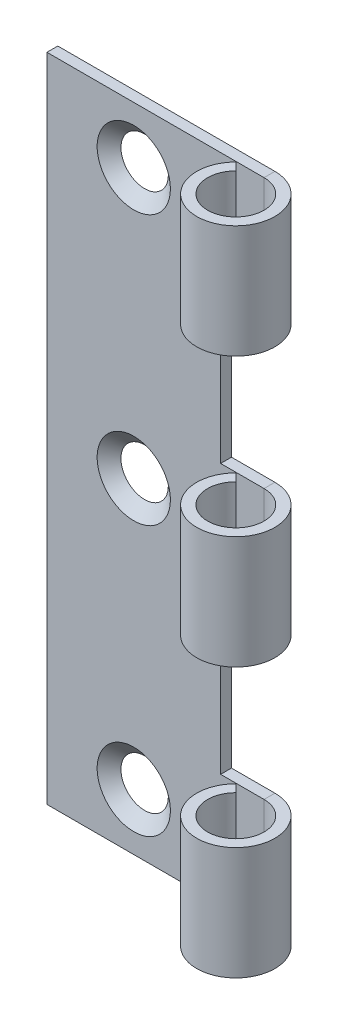
ISO-10303-21;
HEADER;
FILE_DESCRIPTION(('STEP AP214'),'2;1');
FILE_NAME('part.step','',(''),(''),'','','');
FILE_SCHEMA(('AUTOMOTIVE_DESIGN { 1 0 10303 214 1 1 1 1 }'));
ENDSEC;
DATA;
#1=APPLICATION_CONTEXT('core data for automotive mechanical design processes');
#2=APPLICATION_PROTOCOL_DEFINITION('international standard','automotive_design',2000,#1);
#3=PRODUCT_CONTEXT('',#1,'mechanical');
#4=PRODUCT('Part','Part','',(#3));
#5=PRODUCT_RELATED_PRODUCT_CATEGORY('part','',(#4));
#6=PRODUCT_DEFINITION_FORMATION('','',#4);
#7=PRODUCT_DEFINITION_CONTEXT('part definition',#1,'design');
#8=PRODUCT_DEFINITION('design','',#6,#7);
#9=PRODUCT_DEFINITION_SHAPE('','',#8);
#10=(LENGTH_UNIT() NAMED_UNIT(*) SI_UNIT(.MILLI.,.METRE.));
#11=(NAMED_UNIT(*) PLANE_ANGLE_UNIT() SI_UNIT($,.RADIAN.));
#12=(NAMED_UNIT(*) SI_UNIT($,.STERADIAN.) SOLID_ANGLE_UNIT());
#13=UNCERTAINTY_MEASURE_WITH_UNIT(LENGTH_MEASURE(1.E-05),#10,'distance_accuracy_value','');
#14=(GEOMETRIC_REPRESENTATION_CONTEXT(3) GLOBAL_UNCERTAINTY_ASSIGNED_CONTEXT((#13)) GLOBAL_UNIT_ASSIGNED_CONTEXT((#10,
#11,#12)) REPRESENTATION_CONTEXT('',''));
#15=CARTESIAN_POINT('',(0.,0.,0.));
#16=DIRECTION('',(0.,0.,1.));
#17=DIRECTION('',(1.,0.,0.));
#18=AXIS2_PLACEMENT_3D('',#15,#16,#17);
#19=CARTESIAN_POINT('',(0.,0.,-0.625));
#20=DIRECTION('',(0.,0.,-1.));
#21=DIRECTION('',(-1.,0.,0.));
#22=AXIS2_PLACEMENT_3D('',#19,#20,#21);
#23=PLANE('',#22);
#24=CARTESIAN_POINT('',(-15.,31.,-0.625));
#25=DIRECTION('',(0.,0.,-1.));
#26=DIRECTION('',(-1.,0.,0.));
#27=AXIS2_PLACEMENT_3D('',#24,#25,#26);
#28=CIRCLE('',#27,2.72670800925724);
#29=CARTESIAN_POINT('',(-17.7267080092572,31.,-0.625));
#30=VERTEX_POINT('',#29);
#31=EDGE_CURVE('E47',#30,#30,#28,.T.);
#32=ORIENTED_EDGE('',*,*,#31,.F.);
#33=EDGE_LOOP('',(#32));
#34=FACE_BOUND('',#33,.T.);
#35=CARTESIAN_POINT('',(-15.,-31.,-0.625));
#36=DIRECTION('',(0.,0.,-1.));
#37=DIRECTION('',(-1.,0.,0.));
#38=AXIS2_PLACEMENT_3D('',#35,#36,#37);
#39=CIRCLE('',#38,2.72670800925724);
#40=CARTESIAN_POINT('',(-17.7267080092572,-31.,-0.625));
#41=VERTEX_POINT('',#40);
#42=EDGE_CURVE('E219',#41,#41,#39,.T.);
#43=ORIENTED_EDGE('',*,*,#42,.F.);
#44=EDGE_LOOP('',(#43));
#45=FACE_BOUND('',#44,.T.);
#46=DIRECTION('',(0.,1.,0.));
#47=VECTOR('',#46,1.);
#48=CARTESIAN_POINT('',(0.,-37.5,-0.625));
#49=LINE('',#48,#47);
#50=CARTESIAN_POINT('',(0.,-37.5,-0.625));
#51=VERTEX_POINT('',#50);
#52=CARTESIAN_POINT('',(0.,-24.5,-0.625));
#53=VERTEX_POINT('',#52);
#54=EDGE_CURVE('E62',#51,#53,#49,.T.);
#55=ORIENTED_EDGE('',*,*,#54,.F.);
#56=DIRECTION('',(1.,0.,0.));
#57=VECTOR('',#56,1.);
#58=CARTESIAN_POINT('',(0.,-37.5,-0.625));
#59=LINE('',#58,#57);
#60=CARTESIAN_POINT('',(-25.,-37.5,-0.625));
#61=VERTEX_POINT('',#60);
#62=EDGE_CURVE('E151',#61,#51,#59,.T.);
#63=ORIENTED_EDGE('',*,*,#62,.F.);
#64=DIRECTION('',(0.,-1.,0.));
#65=VECTOR('',#64,1.);
#66=CARTESIAN_POINT('',(-25.,-37.5,-0.625));
#67=LINE('',#66,#65);
#68=CARTESIAN_POINT('',(-25.,37.5,-0.625));
#69=VERTEX_POINT('',#68);
#70=EDGE_CURVE('E139',#69,#61,#67,.T.);
#71=ORIENTED_EDGE('',*,*,#70,.F.);
#72=DIRECTION('',(-1.,0.,0.));
#73=VECTOR('',#72,1.);
#74=CARTESIAN_POINT('',(0.,37.5,-0.625));
#75=LINE('',#74,#73);
#76=CARTESIAN_POINT('',(0.,37.5,-0.625));
#77=VERTEX_POINT('',#76);
#78=EDGE_CURVE('E149',#77,#69,#75,.T.);
#79=ORIENTED_EDGE('',*,*,#78,.F.);
#80=DIRECTION('',(0.,1.,0.));
#81=VECTOR('',#80,1.);
#82=CARTESIAN_POINT('',(0.,24.5,-0.625));
#83=LINE('',#82,#81);
#84=CARTESIAN_POINT('',(0.,24.5,-0.625));
#85=VERTEX_POINT('',#84);
#86=EDGE_CURVE('E155',#85,#77,#83,.T.);
#87=ORIENTED_EDGE('',*,*,#86,.F.);
#88=DIRECTION('',(1.,0.,0.));
#89=VECTOR('',#88,1.);
#90=CARTESIAN_POINT('',(0.,24.5,-0.625));
#91=LINE('',#90,#89);
#92=CARTESIAN_POINT('',(-4.99999999999997,24.5,-0.625));
#93=VERTEX_POINT('',#92);
#94=EDGE_CURVE('E157',#93,#85,#91,.T.);
#95=ORIENTED_EDGE('',*,*,#94,.F.);
#96=DIRECTION('',(0.,1.,0.));
#97=VECTOR('',#96,1.);
#98=CARTESIAN_POINT('',(-4.99999999999997,24.5,-0.625));
#99=LINE('',#98,#97);
#100=CARTESIAN_POINT('',(-5.,6.5,-0.625));
#101=VERTEX_POINT('',#100);
#102=EDGE_CURVE('E317',#101,#93,#99,.T.);
#103=ORIENTED_EDGE('',*,*,#102,.F.);
#104=DIRECTION('',(-1.,0.,0.));
#105=VECTOR('',#104,1.);
#106=CARTESIAN_POINT('',(-5.,6.5,-0.625));
#107=LINE('',#106,#105);
#108=CARTESIAN_POINT('',(0.,6.5,-0.625));
#109=VERTEX_POINT('',#108);
#110=EDGE_CURVE('E314',#109,#101,#107,.T.);
#111=ORIENTED_EDGE('',*,*,#110,.F.);
#112=DIRECTION('',(0.,1.,0.));
#113=VECTOR('',#112,1.);
#114=CARTESIAN_POINT('',(0.,-6.5,-0.625));
#115=LINE('',#114,#113);
#116=CARTESIAN_POINT('',(0.,-6.5,-0.625));
#117=VERTEX_POINT('',#116);
#118=EDGE_CURVE('E311',#117,#109,#115,.T.);
#119=ORIENTED_EDGE('',*,*,#118,.F.);
#120=DIRECTION('',(1.,0.,0.));
#121=VECTOR('',#120,1.);
#122=CARTESIAN_POINT('',(0.,-6.5,-0.625));
#123=LINE('',#122,#121);
#124=CARTESIAN_POINT('',(-4.99999999999997,-6.5,-0.625));
#125=VERTEX_POINT('',#124);
#126=EDGE_CURVE('E308',#125,#117,#123,.T.);
#127=ORIENTED_EDGE('',*,*,#126,.F.);
#128=DIRECTION('',(0.,1.,0.));
#129=VECTOR('',#128,1.);
#130=CARTESIAN_POINT('',(-4.99999999999997,-6.5,-0.625));
#131=LINE('',#130,#129);
#132=CARTESIAN_POINT('',(-5.,-24.5,-0.625));
#133=VERTEX_POINT('',#132);
#134=EDGE_CURVE('E305',#133,#125,#131,.T.);
#135=ORIENTED_EDGE('',*,*,#134,.F.);
#136=DIRECTION('',(-1.,0.,0.));
#137=VECTOR('',#136,1.);
#138=CARTESIAN_POINT('',(-5.,-24.5,-0.625));
#139=LINE('',#138,#137);
#140=EDGE_CURVE('E303',#53,#133,#139,.T.);
#141=ORIENTED_EDGE('',*,*,#140,.F.);
#142=EDGE_LOOP('',(#55,#63,#71,#79,#87,#95,#103,#111,#119,#127,#135,#141));
#143=FACE_BOUND('',#142,.T.);
#144=CARTESIAN_POINT('',(-15.,0.,-0.625));
#145=DIRECTION('',(0.,0.,-1.));
#146=DIRECTION('',(-1.,0.,0.));
#147=AXIS2_PLACEMENT_3D('',#144,#145,#146);
#148=CIRCLE('',#147,2.72670800925724);
#149=CARTESIAN_POINT('',(-17.7267080092572,0.,-0.625));
#150=VERTEX_POINT('',#149);
#151=EDGE_CURVE('E212',#150,#150,#148,.T.);
#152=ORIENTED_EDGE('',*,*,#151,.F.);
#153=EDGE_LOOP('',(#152));
#154=FACE_BOUND('',#153,.T.);
#155=ADVANCED_FACE('F43',(#34,#45,#143,#154),#23,.T.);
#156=CARTESIAN_POINT('',(0.,-37.5,-0.625));
#157=DIRECTION('',(0.,-1.,0.));
#158=DIRECTION('',(0.,0.,-1.));
#159=AXIS2_PLACEMENT_3D('',#156,#157,#158);
#160=PLANE('',#159);
#161=DIRECTION('',(1.,0.,0.));
#162=VECTOR('',#161,1.);
#163=CARTESIAN_POINT('',(0.,-37.5,0.625));
#164=LINE('',#163,#162);
#165=CARTESIAN_POINT('',(-25.,-37.5,0.625));
#166=VERTEX_POINT('',#165);
#167=CARTESIAN_POINT('',(0.,-37.5,0.625));
#168=VERTEX_POINT('',#167);
#169=EDGE_CURVE('E193',#166,#168,#164,.T.);
#170=ORIENTED_EDGE('',*,*,#169,.F.);
#171=DIRECTION('',(0.,0.,1.));
#172=VECTOR('',#171,1.);
#173=CARTESIAN_POINT('',(-25.,-37.5,-0.625));
#174=LINE('',#173,#172);
#175=EDGE_CURVE('E53',#61,#166,#174,.T.);
#176=ORIENTED_EDGE('',*,*,#175,.F.);
#177=ORIENTED_EDGE('',*,*,#62,.T.);
#178=DIRECTION('',(0.,0.,1.));
#179=VECTOR('',#178,1.);
#180=CARTESIAN_POINT('',(0.,-37.5,-0.625));
#181=LINE('',#180,#179);
#182=EDGE_CURVE('E11',#51,#168,#181,.T.);
#183=ORIENTED_EDGE('',*,*,#182,.T.);
#184=EDGE_LOOP('',(#170,#176,#177,#183));
#185=FACE_BOUND('',#184,.T.);
#186=ADVANCED_FACE('F399',(#185),#160,.T.);
#187=CARTESIAN_POINT('',(-25.,-37.5,-0.625));
#188=DIRECTION('',(-1.,0.,0.));
#189=DIRECTION('',(0.,0.,1.));
#190=AXIS2_PLACEMENT_3D('',#187,#188,#189);
#191=PLANE('',#190);
#192=DIRECTION('',(0.,-1.,0.));
#193=VECTOR('',#192,1.);
#194=CARTESIAN_POINT('',(-25.,-37.5,0.625));
#195=LINE('',#194,#193);
#196=CARTESIAN_POINT('',(-25.,37.5,0.625));
#197=VERTEX_POINT('',#196);
#198=EDGE_CURVE('E140',#197,#166,#195,.T.);
#199=ORIENTED_EDGE('',*,*,#198,.F.);
#200=DIRECTION('',(0.,0.,1.));
#201=VECTOR('',#200,1.);
#202=CARTESIAN_POINT('',(-25.,37.5,-0.625));
#203=LINE('',#202,#201);
#204=EDGE_CURVE('E136',#69,#197,#203,.T.);
#205=ORIENTED_EDGE('',*,*,#204,.F.);
#206=ORIENTED_EDGE('',*,*,#70,.T.);
#207=ORIENTED_EDGE('',*,*,#175,.T.);
#208=EDGE_LOOP('',(#199,#205,#206,#207));
#209=FACE_BOUND('',#208,.T.);
#210=ADVANCED_FACE('F138',(#209),#191,.T.);
#211=CARTESIAN_POINT('',(0.,37.5,-0.625));
#212=DIRECTION('',(0.,1.,0.));
#213=DIRECTION('',(-1.,0.,0.));
#214=AXIS2_PLACEMENT_3D('',#211,#212,#213);
#215=PLANE('',#214);
#216=DIRECTION('',(-1.,0.,0.));
#217=VECTOR('',#216,1.);
#218=CARTESIAN_POINT('',(0.,37.5,0.625));
#219=LINE('',#218,#217);
#220=CARTESIAN_POINT('',(0.,37.5,0.625000000000001));
#221=VERTEX_POINT('',#220);
#222=EDGE_CURVE('E190',#221,#197,#219,.T.);
#223=ORIENTED_EDGE('',*,*,#222,.F.);
#224=DIRECTION('',(0.,0.,1.));
#225=VECTOR('',#224,1.);
#226=CARTESIAN_POINT('',(0.,37.5,-0.625));
#227=LINE('',#226,#225);
#228=EDGE_CURVE('E145',#77,#221,#227,.T.);
#229=ORIENTED_EDGE('',*,*,#228,.F.);
#230=ORIENTED_EDGE('',*,*,#78,.T.);
#231=ORIENTED_EDGE('',*,*,#204,.T.);
#232=EDGE_LOOP('',(#223,#229,#230,#231));
#233=FACE_BOUND('',#232,.T.);
#234=ADVANCED_FACE('F153',(#233),#215,.T.);
#235=CARTESIAN_POINT('',(0.,24.5,-0.625));
#236=DIRECTION('',(0.,-1.,0.));
#237=DIRECTION('',(0.,0.,-1.));
#238=AXIS2_PLACEMENT_3D('',#235,#236,#237);
#239=PLANE('',#238);
#240=DIRECTION('',(1.,0.,0.));
#241=VECTOR('',#240,1.);
#242=CARTESIAN_POINT('',(0.,24.5,0.625));
#243=LINE('',#242,#241);
#244=CARTESIAN_POINT('',(-4.99999999999997,24.5,0.625));
#245=VERTEX_POINT('',#244);
#246=CARTESIAN_POINT('',(0.,24.5,0.625));
#247=VERTEX_POINT('',#246);
#248=EDGE_CURVE('E184',#245,#247,#243,.T.);
#249=ORIENTED_EDGE('',*,*,#248,.F.);
#250=DIRECTION('',(0.,0.,1.));
#251=VECTOR('',#250,1.);
#252=CARTESIAN_POINT('',(-4.99999999999997,24.5,-0.625));
#253=LINE('',#252,#251);
#254=EDGE_CURVE('E199',#93,#245,#253,.T.);
#255=ORIENTED_EDGE('',*,*,#254,.F.);
#256=ORIENTED_EDGE('',*,*,#94,.T.);
#257=DIRECTION('',(0.,0.,1.));
#258=VECTOR('',#257,1.);
#259=CARTESIAN_POINT('',(0.,24.5,-0.625));
#260=LINE('',#259,#258);
#261=EDGE_CURVE('E197',#85,#247,#260,.T.);
#262=ORIENTED_EDGE('',*,*,#261,.T.);
#263=EDGE_LOOP('',(#249,#255,#256,#262));
#264=FACE_BOUND('',#263,.T.);
#265=ADVANCED_FACE('F324',(#264),#239,.T.);
#266=CARTESIAN_POINT('',(-4.99999999999997,24.5,-0.625));
#267=DIRECTION('',(1.,0.,0.));
#268=DIRECTION('',(0.,1.,0.));
#269=AXIS2_PLACEMENT_3D('',#266,#267,#268);
#270=PLANE('',#269);
#271=DIRECTION('',(0.,1.,0.));
#272=VECTOR('',#271,1.);
#273=CARTESIAN_POINT('',(-4.99999999999997,24.5,0.625));
#274=LINE('',#273,#272);
#275=CARTESIAN_POINT('',(-5.,6.5,0.625));
#276=VERTEX_POINT('',#275);
#277=EDGE_CURVE('E181',#276,#245,#274,.T.);
#278=ORIENTED_EDGE('',*,*,#277,.F.);
#279=DIRECTION('',(0.,0.,1.));
#280=VECTOR('',#279,1.);
#281=CARTESIAN_POINT('',(-5.,6.5,-0.625));
#282=LINE('',#281,#280);
#283=EDGE_CURVE('E201',#101,#276,#282,.T.);
#284=ORIENTED_EDGE('',*,*,#283,.F.);
#285=ORIENTED_EDGE('',*,*,#102,.T.);
#286=ORIENTED_EDGE('',*,*,#254,.T.);
#287=EDGE_LOOP('',(#278,#284,#285,#286));
#288=FACE_BOUND('',#287,.T.);
#289=ADVANCED_FACE('F419',(#288),#270,.T.);
#290=CARTESIAN_POINT('',(-5.,6.5,-0.625));
#291=DIRECTION('',(0.,1.,0.));
#292=DIRECTION('',(-1.,0.,0.));
#293=AXIS2_PLACEMENT_3D('',#290,#291,#292);
#294=PLANE('',#293);
#295=DIRECTION('',(-1.,0.,0.));
#296=VECTOR('',#295,1.);
#297=CARTESIAN_POINT('',(-5.,6.5,0.625));
#298=LINE('',#297,#296);
#299=CARTESIAN_POINT('',(0.,6.5,0.625));
#300=VERTEX_POINT('',#299);
#301=EDGE_CURVE('E178',#300,#276,#298,.T.);
#302=ORIENTED_EDGE('',*,*,#301,.F.);
#303=DIRECTION('',(0.,0.,1.));
#304=VECTOR('',#303,1.);
#305=CARTESIAN_POINT('',(0.,6.5,-0.625));
#306=LINE('',#305,#304);
#307=EDGE_CURVE('E203',#109,#300,#306,.T.);
#308=ORIENTED_EDGE('',*,*,#307,.F.);
#309=ORIENTED_EDGE('',*,*,#110,.T.);
#310=ORIENTED_EDGE('',*,*,#283,.T.);
#311=EDGE_LOOP('',(#302,#308,#309,#310));
#312=FACE_BOUND('',#311,.T.);
#313=ADVANCED_FACE('F422',(#312),#294,.T.);
#314=CARTESIAN_POINT('',(0.,-6.5,-0.625));
#315=DIRECTION('',(0.,-1.,0.));
#316=DIRECTION('',(1.,0.,0.));
#317=AXIS2_PLACEMENT_3D('',#314,#315,#316);
#318=PLANE('',#317);
#319=DIRECTION('',(1.,0.,0.));
#320=VECTOR('',#319,1.);
#321=CARTESIAN_POINT('',(0.,-6.5,0.625));
#322=LINE('',#321,#320);
#323=CARTESIAN_POINT('',(-4.99999999999997,-6.5,0.625));
#324=VERTEX_POINT('',#323);
#325=CARTESIAN_POINT('',(0.,-6.5,0.625));
#326=VERTEX_POINT('',#325);
#327=EDGE_CURVE('E172',#324,#326,#322,.T.);
#328=ORIENTED_EDGE('',*,*,#327,.F.);
#329=DIRECTION('',(0.,0.,1.));
#330=VECTOR('',#329,1.);
#331=CARTESIAN_POINT('',(-4.99999999999997,-6.5,-0.625));
#332=LINE('',#331,#330);
#333=EDGE_CURVE('E208',#125,#324,#332,.T.);
#334=ORIENTED_EDGE('',*,*,#333,.F.);
#335=ORIENTED_EDGE('',*,*,#126,.T.);
#336=DIRECTION('',(0.,0.,1.));
#337=VECTOR('',#336,1.);
#338=CARTESIAN_POINT('',(0.,-6.5,-0.625));
#339=LINE('',#338,#337);
#340=EDGE_CURVE('E206',#117,#326,#339,.T.);
#341=ORIENTED_EDGE('',*,*,#340,.T.);
#342=EDGE_LOOP('',(#328,#334,#335,#341));
#343=FACE_BOUND('',#342,.T.);
#344=ADVANCED_FACE('F426',(#343),#318,.T.);
#345=CARTESIAN_POINT('',(-4.99999999999997,-6.5,-0.625));
#346=DIRECTION('',(1.,0.,0.));
#347=DIRECTION('',(0.,1.,0.));
#348=AXIS2_PLACEMENT_3D('',#345,#346,#347);
#349=PLANE('',#348);
#350=DIRECTION('',(0.,1.,0.));
#351=VECTOR('',#350,1.);
#352=CARTESIAN_POINT('',(-4.99999999999997,-6.5,0.625));
#353=LINE('',#352,#351);
#354=CARTESIAN_POINT('',(-5.,-24.5,0.625));
#355=VERTEX_POINT('',#354);
#356=EDGE_CURVE('E169',#355,#324,#353,.T.);
#357=ORIENTED_EDGE('',*,*,#356,.F.);
#358=DIRECTION('',(0.,0.,1.));
#359=VECTOR('',#358,1.);
#360=CARTESIAN_POINT('',(-5.,-24.5,-0.625));
#361=LINE('',#360,#359);
#362=EDGE_CURVE('E210',#133,#355,#361,.T.);
#363=ORIENTED_EDGE('',*,*,#362,.F.);
#364=ORIENTED_EDGE('',*,*,#134,.T.);
#365=ORIENTED_EDGE('',*,*,#333,.T.);
#366=EDGE_LOOP('',(#357,#363,#364,#365));
#367=FACE_BOUND('',#366,.T.);
#368=ADVANCED_FACE('F429',(#367),#349,.T.);
#369=CARTESIAN_POINT('',(-5.,-24.5,-0.625));
#370=DIRECTION('',(0.,1.,0.));
#371=DIRECTION('',(-1.,0.,0.));
#372=AXIS2_PLACEMENT_3D('',#369,#370,#371);
#373=PLANE('',#372);
#374=DIRECTION('',(-1.,0.,0.));
#375=VECTOR('',#374,1.);
#376=CARTESIAN_POINT('',(-5.,-24.5,0.625));
#377=LINE('',#376,#375);
#378=CARTESIAN_POINT('',(0.,-24.5,0.625));
#379=VERTEX_POINT('',#378);
#380=EDGE_CURVE('E165',#379,#355,#377,.T.);
#381=ORIENTED_EDGE('',*,*,#380,.F.);
#382=DIRECTION('',(0.,0.,1.));
#383=VECTOR('',#382,1.);
#384=CARTESIAN_POINT('',(0.,-24.5,-0.625));
#385=LINE('',#384,#383);
#386=EDGE_CURVE('E108',#53,#379,#385,.T.);
#387=ORIENTED_EDGE('',*,*,#386,.F.);
#388=ORIENTED_EDGE('',*,*,#140,.T.);
#389=ORIENTED_EDGE('',*,*,#362,.T.);
#390=EDGE_LOOP('',(#381,#387,#388,#389));
#391=FACE_BOUND('',#390,.T.);
#392=ADVANCED_FACE('F45',(#391),#373,.T.);
#393=CARTESIAN_POINT('',(0.,0.,0.625));
#394=DIRECTION('',(0.,0.,-1.));
#395=DIRECTION('',(-1.,0.,0.));
#396=AXIS2_PLACEMENT_3D('',#393,#394,#395);
#397=PLANE('',#396);
#398=CARTESIAN_POINT('',(-15.,31.,0.625));
#399=DIRECTION('',(0.,0.,1.));
#400=DIRECTION('',(1.,0.,0.));
#401=AXIS2_PLACEMENT_3D('',#398,#399,#400);
#402=CIRCLE('',#401,4.2164);
#403=CARTESIAN_POINT('',(-10.7836,31.,0.625));
#404=VERTEX_POINT('',#403);
#405=EDGE_CURVE('E226',#404,#404,#402,.T.);
#406=ORIENTED_EDGE('',*,*,#405,.F.);
#407=EDGE_LOOP('',(#406));
#408=FACE_BOUND('',#407,.T.);
#409=CARTESIAN_POINT('',(-15.,0.,0.625));
#410=DIRECTION('',(0.,0.,1.));
#411=DIRECTION('',(1.,0.,0.));
#412=AXIS2_PLACEMENT_3D('',#409,#410,#411);
#413=CIRCLE('',#412,4.2164);
#414=CARTESIAN_POINT('',(-10.7836,0.,0.625));
#415=VERTEX_POINT('',#414);
#416=EDGE_CURVE('E215',#415,#415,#413,.T.);
#417=ORIENTED_EDGE('',*,*,#416,.F.);
#418=EDGE_LOOP('',(#417));
#419=FACE_BOUND('',#418,.T.);
#420=CARTESIAN_POINT('',(-15.,-31.,0.625));
#421=DIRECTION('',(0.,0.,1.));
#422=DIRECTION('',(1.,0.,0.));
#423=AXIS2_PLACEMENT_3D('',#420,#421,#422);
#424=CIRCLE('',#423,4.2164);
#425=CARTESIAN_POINT('',(-10.7836,-31.,0.625));
#426=VERTEX_POINT('',#425);
#427=EDGE_CURVE('E214',#426,#426,#424,.T.);
#428=ORIENTED_EDGE('',*,*,#427,.F.);
#429=EDGE_LOOP('',(#428));
#430=FACE_BOUND('',#429,.T.);
#431=DIRECTION('',(0.,1.,0.));
#432=VECTOR('',#431,1.);
#433=CARTESIAN_POINT('',(0.,-37.5,0.625));
#434=LINE('',#433,#432);
#435=EDGE_CURVE('E162',#168,#379,#434,.T.);
#436=ORIENTED_EDGE('',*,*,#435,.T.);
#437=ORIENTED_EDGE('',*,*,#380,.T.);
#438=ORIENTED_EDGE('',*,*,#356,.T.);
#439=ORIENTED_EDGE('',*,*,#327,.T.);
#440=DIRECTION('',(0.,1.,0.));
#441=VECTOR('',#440,1.);
#442=CARTESIAN_POINT('',(0.,-6.5,0.625));
#443=LINE('',#442,#441);
#444=EDGE_CURVE('E175',#326,#300,#443,.T.);
#445=ORIENTED_EDGE('',*,*,#444,.T.);
#446=ORIENTED_EDGE('',*,*,#301,.T.);
#447=ORIENTED_EDGE('',*,*,#277,.T.);
#448=ORIENTED_EDGE('',*,*,#248,.T.);
#449=DIRECTION('',(0.,1.,0.));
#450=VECTOR('',#449,1.);
#451=CARTESIAN_POINT('',(0.,24.5,0.625));
#452=LINE('',#451,#450);
#453=EDGE_CURVE('E187',#247,#221,#452,.T.);
#454=ORIENTED_EDGE('',*,*,#453,.T.);
#455=ORIENTED_EDGE('',*,*,#222,.T.);
#456=ORIENTED_EDGE('',*,*,#198,.T.);
#457=ORIENTED_EDGE('',*,*,#169,.T.);
#458=EDGE_LOOP('',(#436,#437,#438,#439,#445,#446,#447,#448,#454,#455,#456,#457));
#459=FACE_BOUND('',#458,.T.);
#460=ADVANCED_FACE('F395',(#408,#419,#430,#459),#397,.F.);
#461=CARTESIAN_POINT('',(-2.29809703885625,-31.,1.57690296114369));
#462=DIRECTION('',(-0.707106781186556,0.,0.707106781186539));
#463=DIRECTION('',(0.,1.,0.));
#464=AXIS2_PLACEMENT_3D('',#461,#462,#463);
#465=PLANE('',#464);
#466=DIRECTION('',(-0.707106781186539,0.,-0.707106781186556));
#467=VECTOR('',#466,1.);
#468=CARTESIAN_POINT('',(-2.29809703885625,-24.5,1.57690296114369));
#469=LINE('',#468,#467);
#470=CARTESIAN_POINT('',(-2.29809703885625,-24.5,1.57690296114369));
#471=VERTEX_POINT('',#470);
#472=CARTESIAN_POINT('',(-3.18198051533943,-24.5,0.693019484660497));
#473=VERTEX_POINT('',#472);
#474=EDGE_CURVE('E166',#471,#473,#469,.T.);
#475=ORIENTED_EDGE('',*,*,#474,.F.);
#476=DIRECTION('',(0.,1.,0.));
#477=VECTOR('',#476,1.);
#478=CARTESIAN_POINT('',(-2.29809703885625,-24.5,1.57690296114369));
#479=LINE('',#478,#477);
#480=CARTESIAN_POINT('',(-2.29809703885625,-37.5,1.57690296114369));
#481=VERTEX_POINT('',#480);
#482=EDGE_CURVE('E279',#481,#471,#479,.T.);
#483=ORIENTED_EDGE('',*,*,#482,.F.);
#484=DIRECTION('',(-0.707106781186539,0.,-0.707106781186556));
#485=VECTOR('',#484,1.);
#486=CARTESIAN_POINT('',(-2.29809703885625,-37.5,1.57690296114369));
#487=LINE('',#486,#485);
#488=CARTESIAN_POINT('',(-3.18198051533943,-37.5,0.693019484660497));
#489=VERTEX_POINT('',#488);
#490=EDGE_CURVE('E283',#481,#489,#487,.T.);
#491=ORIENTED_EDGE('',*,*,#490,.T.);
#492=DIRECTION('',(0.,1.,0.));
#493=VECTOR('',#492,1.);
#494=CARTESIAN_POINT('',(-3.18198051533943,-24.5,0.693019484660497));
#495=LINE('',#494,#493);
#496=EDGE_CURVE('E285',#489,#473,#495,.T.);
#497=ORIENTED_EDGE('',*,*,#496,.T.);
#498=EDGE_LOOP('',(#475,#483,#491,#497));
#499=FACE_BOUND('',#498,.T.);
#500=ADVANCED_FACE('F375',(#499),#465,.F.);
#501=CARTESIAN_POINT('',(0.,-37.5,3.875));
#502=DIRECTION('',(0.,-1.,0.));
#503=DIRECTION('',(0.,0.,-1.));
#504=AXIS2_PLACEMENT_3D('',#501,#502,#503);
#505=PLANE('',#504);
#506=ORIENTED_EDGE('',*,*,#490,.F.);
#507=CARTESIAN_POINT('',(0.,-37.5,3.875));
#508=DIRECTION('',(0.,1.,0.));
#509=DIRECTION('',(0.,0.,1.));
#510=AXIS2_PLACEMENT_3D('',#507,#508,#509);
#511=CIRCLE('',#510,3.25);
#512=EDGE_CURVE('E288',#168,#481,#511,.F.);
#513=ORIENTED_EDGE('',*,*,#512,.F.);
#514=ORIENTED_EDGE('',*,*,#182,.F.);
#515=CARTESIAN_POINT('',(0.,-37.5,3.875));
#516=DIRECTION('',(0.,1.,0.));
#517=DIRECTION('',(0.,0.,1.));
#518=AXIS2_PLACEMENT_3D('',#515,#516,#517);
#519=CIRCLE('',#518,4.5);
#520=EDGE_CURVE('E280',#51,#489,#519,.F.);
#521=ORIENTED_EDGE('',*,*,#520,.T.);
#522=EDGE_LOOP('',(#506,#513,#514,#521));
#523=FACE_BOUND('',#522,.T.);
#524=ADVANCED_FACE('F387',(#523),#505,.T.);
#525=CARTESIAN_POINT('',(0.,-24.5,3.875));
#526=DIRECTION('',(0.,-1.,0.));
#527=DIRECTION('',(0.,0.,-1.));
#528=AXIS2_PLACEMENT_3D('',#525,#526,#527);
#529=PLANE('',#528);
#530=CARTESIAN_POINT('',(0.,-24.5,3.875));
#531=DIRECTION('',(0.,1.,0.));
#532=DIRECTION('',(0.,0.,1.));
#533=AXIS2_PLACEMENT_3D('',#530,#531,#532);
#534=CIRCLE('',#533,3.25);
#535=EDGE_CURVE('E293',#471,#379,#534,.T.);
#536=ORIENTED_EDGE('',*,*,#535,.F.);
#537=ORIENTED_EDGE('',*,*,#474,.T.);
#538=CARTESIAN_POINT('',(0.,-24.5,3.875));
#539=DIRECTION('',(0.,1.,0.));
#540=DIRECTION('',(0.,0.,1.));
#541=AXIS2_PLACEMENT_3D('',#538,#539,#540);
#542=CIRCLE('',#541,4.5);
#543=EDGE_CURVE('E284',#473,#53,#542,.T.);
#544=ORIENTED_EDGE('',*,*,#543,.T.);
#545=ORIENTED_EDGE('',*,*,#386,.T.);
#546=EDGE_LOOP('',(#536,#537,#544,#545));
#547=FACE_BOUND('',#546,.T.);
#548=ADVANCED_FACE('F383',(#547),#529,.F.);
#549=CARTESIAN_POINT('',(0.,-24.5,3.875));
#550=DIRECTION('',(0.,1.,0.));
#551=DIRECTION('',(-0.707106781186539,0.,-0.707106781186556));
#552=AXIS2_PLACEMENT_3D('',#549,#550,#551);
#553=CYLINDRICAL_SURFACE('',#552,4.5);
#554=ORIENTED_EDGE('',*,*,#54,.T.);
#555=ORIENTED_EDGE('',*,*,#543,.F.);
#556=ORIENTED_EDGE('',*,*,#496,.F.);
#557=ORIENTED_EDGE('',*,*,#520,.F.);
#558=EDGE_LOOP('',(#554,#555,#556,#557));
#559=FACE_BOUND('',#558,.T.);
#560=ADVANCED_FACE('F385',(#559),#553,.T.);
#561=CARTESIAN_POINT('',(0.,-24.5,3.875));
#562=DIRECTION('',(0.,1.,0.));
#563=DIRECTION('',(-0.707106781186539,0.,-0.707106781186556));
#564=AXIS2_PLACEMENT_3D('',#561,#562,#563);
#565=CYLINDRICAL_SURFACE('',#564,3.25);
#566=ORIENTED_EDGE('',*,*,#435,.F.);
#567=ORIENTED_EDGE('',*,*,#512,.T.);
#568=ORIENTED_EDGE('',*,*,#482,.T.);
#569=ORIENTED_EDGE('',*,*,#535,.T.);
#570=EDGE_LOOP('',(#566,#567,#568,#569));
#571=FACE_BOUND('',#570,.T.);
#572=ADVANCED_FACE('F382',(#571),#565,.F.);
#573=CARTESIAN_POINT('',(-2.29809703885625,0.,1.57690296114369));
#574=DIRECTION('',(-0.707106781186556,0.,0.707106781186539));
#575=DIRECTION('',(0.,1.,0.));
#576=AXIS2_PLACEMENT_3D('',#573,#574,#575);
#577=PLANE('',#576);
#578=DIRECTION('',(-0.707106781186539,0.,-0.707106781186556));
#579=VECTOR('',#578,1.);
#580=CARTESIAN_POINT('',(-2.29809703885625,6.5,1.57690296114369));
#581=LINE('',#580,#579);
#582=CARTESIAN_POINT('',(-2.29809703885625,6.5,1.57690296114369));
#583=VERTEX_POINT('',#582);
#584=CARTESIAN_POINT('',(-3.18198051533942,6.5,0.693019484660497));
#585=VERTEX_POINT('',#584);
#586=EDGE_CURVE('E276',#583,#585,#581,.T.);
#587=ORIENTED_EDGE('',*,*,#586,.F.);
#588=DIRECTION('',(0.,1.,0.));
#589=VECTOR('',#588,1.);
#590=CARTESIAN_POINT('',(-2.29809703885625,6.5,1.57690296114369));
#591=LINE('',#590,#589);
#592=CARTESIAN_POINT('',(-2.29809703885625,-6.5,1.57690296114369));
#593=VERTEX_POINT('',#592);
#594=EDGE_CURVE('E255',#593,#583,#591,.T.);
#595=ORIENTED_EDGE('',*,*,#594,.F.);
#596=DIRECTION('',(-0.707106781186539,0.,-0.707106781186556));
#597=VECTOR('',#596,1.);
#598=CARTESIAN_POINT('',(-2.29809703885625,-6.5,1.57690296114369));
#599=LINE('',#598,#597);
#600=CARTESIAN_POINT('',(-3.18198051533942,-6.5,0.693019484660497));
#601=VERTEX_POINT('',#600);
#602=EDGE_CURVE('E259',#593,#601,#599,.T.);
#603=ORIENTED_EDGE('',*,*,#602,.T.);
#604=DIRECTION('',(0.,1.,0.));
#605=VECTOR('',#604,1.);
#606=CARTESIAN_POINT('',(-3.18198051533942,6.5,0.693019484660497));
#607=LINE('',#606,#605);
#608=EDGE_CURVE('E261',#601,#585,#607,.T.);
#609=ORIENTED_EDGE('',*,*,#608,.T.);
#610=EDGE_LOOP('',(#587,#595,#603,#609));
#611=FACE_BOUND('',#610,.T.);
#612=ADVANCED_FACE('F452',(#611),#577,.F.);
#613=CARTESIAN_POINT('',(0.,-6.5,3.875));
#614=DIRECTION('',(0.,-1.,0.));
#615=DIRECTION('',(1.,0.,0.));
#616=AXIS2_PLACEMENT_3D('',#613,#614,#615);
#617=PLANE('',#616);
#618=ORIENTED_EDGE('',*,*,#602,.F.);
#619=CARTESIAN_POINT('',(0.,-6.5,3.875));
#620=DIRECTION('',(0.,1.,0.));
#621=DIRECTION('',(-1.,0.,0.));
#622=AXIS2_PLACEMENT_3D('',#619,#620,#621);
#623=CIRCLE('',#622,3.25);
#624=EDGE_CURVE('E264',#326,#593,#623,.F.);
#625=ORIENTED_EDGE('',*,*,#624,.F.);
#626=ORIENTED_EDGE('',*,*,#340,.F.);
#627=CARTESIAN_POINT('',(0.,-6.5,3.875));
#628=DIRECTION('',(0.,1.,0.));
#629=DIRECTION('',(-1.,0.,0.));
#630=AXIS2_PLACEMENT_3D('',#627,#628,#629);
#631=CIRCLE('',#630,4.5);
#632=EDGE_CURVE('E256',#117,#601,#631,.F.);
#633=ORIENTED_EDGE('',*,*,#632,.T.);
#634=EDGE_LOOP('',(#618,#625,#626,#633));
#635=FACE_BOUND('',#634,.T.);
#636=ADVANCED_FACE('F446',(#635),#617,.T.);
#637=CARTESIAN_POINT('',(0.,6.5,3.875));
#638=DIRECTION('',(0.,-1.,0.));
#639=DIRECTION('',(1.,0.,0.));
#640=AXIS2_PLACEMENT_3D('',#637,#638,#639);
#641=PLANE('',#640);
#642=CARTESIAN_POINT('',(0.,6.5,3.875));
#643=DIRECTION('',(0.,1.,0.));
#644=DIRECTION('',(-1.,0.,0.));
#645=AXIS2_PLACEMENT_3D('',#642,#643,#644);
#646=CIRCLE('',#645,3.25);
#647=EDGE_CURVE('E269',#583,#300,#646,.T.);
#648=ORIENTED_EDGE('',*,*,#647,.F.);
#649=ORIENTED_EDGE('',*,*,#586,.T.);
#650=CARTESIAN_POINT('',(0.,6.5,3.875));
#651=DIRECTION('',(0.,1.,0.));
#652=DIRECTION('',(-1.,0.,0.));
#653=AXIS2_PLACEMENT_3D('',#650,#651,#652);
#654=CIRCLE('',#653,4.5);
#655=EDGE_CURVE('E260',#585,#109,#654,.T.);
#656=ORIENTED_EDGE('',*,*,#655,.T.);
#657=ORIENTED_EDGE('',*,*,#307,.T.);
#658=EDGE_LOOP('',(#648,#649,#656,#657));
#659=FACE_BOUND('',#658,.T.);
#660=ADVANCED_FACE('F461',(#659),#641,.F.);
#661=CARTESIAN_POINT('',(0.,6.5,3.875));
#662=DIRECTION('',(0.,1.,0.));
#663=DIRECTION('',(-0.707106781186539,0.,-0.707106781186556));
#664=AXIS2_PLACEMENT_3D('',#661,#662,#663);
#665=CYLINDRICAL_SURFACE('',#664,4.5);
#666=ORIENTED_EDGE('',*,*,#118,.T.);
#667=ORIENTED_EDGE('',*,*,#655,.F.);
#668=ORIENTED_EDGE('',*,*,#608,.F.);
#669=ORIENTED_EDGE('',*,*,#632,.F.);
#670=EDGE_LOOP('',(#666,#667,#668,#669));
#671=FACE_BOUND('',#670,.T.);
#672=ADVANCED_FACE('F449',(#671),#665,.T.);
#673=CARTESIAN_POINT('',(0.,6.5,3.875));
#674=DIRECTION('',(0.,1.,0.));
#675=DIRECTION('',(-0.707106781186539,0.,-0.707106781186556));
#676=AXIS2_PLACEMENT_3D('',#673,#674,#675);
#677=CYLINDRICAL_SURFACE('',#676,3.25);
#678=ORIENTED_EDGE('',*,*,#444,.F.);
#679=ORIENTED_EDGE('',*,*,#624,.T.);
#680=ORIENTED_EDGE('',*,*,#594,.T.);
#681=ORIENTED_EDGE('',*,*,#647,.T.);
#682=EDGE_LOOP('',(#678,#679,#680,#681));
#683=FACE_BOUND('',#682,.T.);
#684=ADVANCED_FACE('F457',(#683),#677,.F.);
#685=CARTESIAN_POINT('',(-2.29809703885626,31.,1.57690296114369));
#686=DIRECTION('',(-0.707106781186556,0.,0.707106781186539));
#687=DIRECTION('',(0.,1.,0.));
#688=AXIS2_PLACEMENT_3D('',#685,#686,#687);
#689=PLANE('',#688);
#690=DIRECTION('',(-0.707106781186539,0.,-0.707106781186556));
#691=VECTOR('',#690,1.);
#692=CARTESIAN_POINT('',(-2.29809703885627,37.5,1.57690296114369));
#693=LINE('',#692,#691);
#694=CARTESIAN_POINT('',(-2.29809703885627,37.5,1.57690296114369));
#695=VERTEX_POINT('',#694);
#696=CARTESIAN_POINT('',(-3.18198051533944,37.5,0.693019484660499));
#697=VERTEX_POINT('',#696);
#698=EDGE_CURVE('E252',#695,#697,#693,.T.);
#699=ORIENTED_EDGE('',*,*,#698,.F.);
#700=DIRECTION('',(0.,1.,0.));
#701=VECTOR('',#700,1.);
#702=CARTESIAN_POINT('',(-2.29809703885627,37.5,1.57690296114369));
#703=LINE('',#702,#701);
#704=CARTESIAN_POINT('',(-2.29809703885626,24.5,1.5769029611437));
#705=VERTEX_POINT('',#704);
#706=EDGE_CURVE('E231',#705,#695,#703,.T.);
#707=ORIENTED_EDGE('',*,*,#706,.F.);
#708=DIRECTION('',(-0.707106781186539,0.,-0.707106781186556));
#709=VECTOR('',#708,1.);
#710=CARTESIAN_POINT('',(-2.29809703885626,24.5,1.5769029611437));
#711=LINE('',#710,#709);
#712=CARTESIAN_POINT('',(-3.18198051533943,24.5,0.6930194846605));
#713=VERTEX_POINT('',#712);
#714=EDGE_CURVE('E235',#705,#713,#711,.T.);
#715=ORIENTED_EDGE('',*,*,#714,.T.);
#716=DIRECTION('',(0.,1.,0.));
#717=VECTOR('',#716,1.);
#718=CARTESIAN_POINT('',(-3.18198051533944,37.5,0.693019484660499));
#719=LINE('',#718,#717);
#720=EDGE_CURVE('E237',#713,#697,#719,.T.);
#721=ORIENTED_EDGE('',*,*,#720,.T.);
#722=EDGE_LOOP('',(#699,#707,#715,#721));
#723=FACE_BOUND('',#722,.T.);
#724=ADVANCED_FACE('F341',(#723),#689,.F.);
#725=CARTESIAN_POINT('',(0.,24.5,3.87500000000001));
#726=DIRECTION('',(0.,-1.,0.));
#727=DIRECTION('',(1.,0.,0.));
#728=AXIS2_PLACEMENT_3D('',#725,#726,#727);
#729=PLANE('',#728);
#730=ORIENTED_EDGE('',*,*,#714,.F.);
#731=CARTESIAN_POINT('',(0.,24.5,3.87500000000001));
#732=DIRECTION('',(0.,1.,0.));
#733=DIRECTION('',(-1.,0.,0.));
#734=AXIS2_PLACEMENT_3D('',#731,#732,#733);
#735=CIRCLE('',#734,3.25000000000001);
#736=EDGE_CURVE('E240',#247,#705,#735,.F.);
#737=ORIENTED_EDGE('',*,*,#736,.F.);
#738=ORIENTED_EDGE('',*,*,#261,.F.);
#739=CARTESIAN_POINT('',(0.,24.5,3.87500000000001));
#740=DIRECTION('',(0.,1.,0.));
#741=DIRECTION('',(-1.,0.,0.));
#742=AXIS2_PLACEMENT_3D('',#739,#740,#741);
#743=CIRCLE('',#742,4.50000000000001);
#744=EDGE_CURVE('E232',#85,#713,#743,.F.);
#745=ORIENTED_EDGE('',*,*,#744,.T.);
#746=EDGE_LOOP('',(#730,#737,#738,#745));
#747=FACE_BOUND('',#746,.T.);
#748=ADVANCED_FACE('F330',(#747),#729,.T.);
#749=CARTESIAN_POINT('',(0.,37.5,3.87500000000001));
#750=DIRECTION('',(0.,-1.,0.));
#751=DIRECTION('',(1.,0.,0.));
#752=AXIS2_PLACEMENT_3D('',#749,#750,#751);
#753=PLANE('',#752);
#754=CARTESIAN_POINT('',(0.,37.5,3.87500000000001));
#755=DIRECTION('',(0.,1.,0.));
#756=DIRECTION('',(-1.,0.,0.));
#757=AXIS2_PLACEMENT_3D('',#754,#755,#756);
#758=CIRCLE('',#757,3.25000000000001);
#759=EDGE_CURVE('E245',#695,#221,#758,.T.);
#760=ORIENTED_EDGE('',*,*,#759,.F.);
#761=ORIENTED_EDGE('',*,*,#698,.T.);
#762=CARTESIAN_POINT('',(0.,37.5,3.87500000000001));
#763=DIRECTION('',(0.,1.,0.));
#764=DIRECTION('',(-1.,0.,0.));
#765=AXIS2_PLACEMENT_3D('',#762,#763,#764);
#766=CIRCLE('',#765,4.50000000000001);
#767=EDGE_CURVE('E236',#697,#77,#766,.T.);
#768=ORIENTED_EDGE('',*,*,#767,.T.);
#769=ORIENTED_EDGE('',*,*,#228,.T.);
#770=EDGE_LOOP('',(#760,#761,#768,#769));
#771=FACE_BOUND('',#770,.T.);
#772=ADVANCED_FACE('F525',(#771),#753,.F.);
#773=CARTESIAN_POINT('',(0.,37.5,3.87500000000001));
#774=DIRECTION('',(0.,1.,0.));
#775=DIRECTION('',(-0.707106781186539,0.,-0.707106781186556));
#776=AXIS2_PLACEMENT_3D('',#773,#774,#775);
#777=CYLINDRICAL_SURFACE('',#776,4.50000000000001);
#778=ORIENTED_EDGE('',*,*,#86,.T.);
#779=ORIENTED_EDGE('',*,*,#767,.F.);
#780=ORIENTED_EDGE('',*,*,#720,.F.);
#781=ORIENTED_EDGE('',*,*,#744,.F.);
#782=EDGE_LOOP('',(#778,#779,#780,#781));
#783=FACE_BOUND('',#782,.T.);
#784=ADVANCED_FACE('F334',(#783),#777,.T.);
#785=CARTESIAN_POINT('',(0.,37.5,3.87500000000001));
#786=DIRECTION('',(0.,1.,0.));
#787=DIRECTION('',(-0.707106781186539,0.,-0.707106781186556));
#788=AXIS2_PLACEMENT_3D('',#785,#786,#787);
#789=CYLINDRICAL_SURFACE('',#788,3.25000000000001);
#790=ORIENTED_EDGE('',*,*,#453,.F.);
#791=ORIENTED_EDGE('',*,*,#736,.T.);
#792=ORIENTED_EDGE('',*,*,#706,.T.);
#793=ORIENTED_EDGE('',*,*,#759,.T.);
#794=EDGE_LOOP('',(#790,#791,#792,#793));
#795=FACE_BOUND('',#794,.T.);
#796=ADVANCED_FACE('F544',(#795),#789,.F.);
#797=CARTESIAN_POINT('',(-15.,-31.,0.625));
#798=DIRECTION('',(0.,0.,1.));
#799=DIRECTION('',(1.,0.,0.));
#800=AXIS2_PLACEMENT_3D('',#797,#798,#799);
#801=CONICAL_SURFACE('',#800,4.2164,0.872664625997164);
#802=ORIENTED_EDGE('',*,*,#42,.T.);
#803=EDGE_LOOP('',(#802));
#804=FACE_BOUND('',#803,.T.);
#805=ORIENTED_EDGE('',*,*,#427,.T.);
#806=EDGE_LOOP('',(#805));
#807=FACE_BOUND('',#806,.T.);
#808=ADVANCED_FACE('F552',(#804,#807),#801,.F.);
#809=CARTESIAN_POINT('',(-15.,0.,0.625));
#810=DIRECTION('',(0.,0.,1.));
#811=DIRECTION('',(1.,0.,0.));
#812=AXIS2_PLACEMENT_3D('',#809,#810,#811);
#813=CONICAL_SURFACE('',#812,4.2164,0.872664625997164);
#814=ORIENTED_EDGE('',*,*,#151,.T.);
#815=EDGE_LOOP('',(#814));
#816=FACE_BOUND('',#815,.T.);
#817=ORIENTED_EDGE('',*,*,#416,.T.);
#818=EDGE_LOOP('',(#817));
#819=FACE_BOUND('',#818,.T.);
#820=ADVANCED_FACE('F569',(#816,#819),#813,.F.);
#821=CARTESIAN_POINT('',(-15.,31.,0.625));
#822=DIRECTION('',(0.,0.,1.));
#823=DIRECTION('',(1.,0.,0.));
#824=AXIS2_PLACEMENT_3D('',#821,#822,#823);
#825=CONICAL_SURFACE('',#824,4.2164,0.872664625997164);
#826=ORIENTED_EDGE('',*,*,#31,.T.);
#827=EDGE_LOOP('',(#826));
#828=FACE_BOUND('',#827,.T.);
#829=ORIENTED_EDGE('',*,*,#405,.T.);
#830=EDGE_LOOP('',(#829));
#831=FACE_BOUND('',#830,.T.);
#832=ADVANCED_FACE('F579',(#828,#831),#825,.F.);
#833=CLOSED_SHELL('',(#155,#186,#210,#234,#265,#289,#313,#344,#368,#392,#460,#500,#524,#548,
#560,#572,#612,#636,#660,#672,#684,#724,#748,#772,#784,#796,#808,#820,#832));
#834=MANIFOLD_SOLID_BREP('B2',#833);
#835=ADVANCED_BREP_SHAPE_REPRESENTATION('',(#18,#834),#14);
#836=SHAPE_DEFINITION_REPRESENTATION(#9,#835);
ENDSEC;
END-ISO-10303-21;
